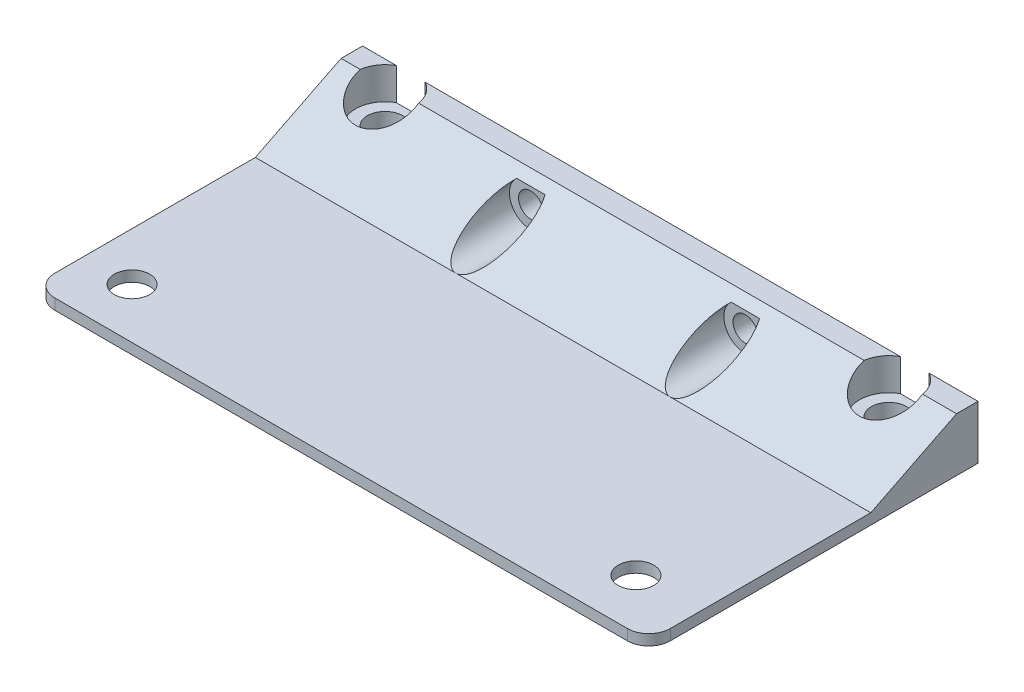
ISO-10303-21;
HEADER;
FILE_DESCRIPTION(('STEP AP214'),'2;1');
FILE_NAME('part.step','',(''),(''),'','','');
FILE_SCHEMA(('AUTOMOTIVE_DESIGN { 1 0 10303 214 1 1 1 1 }'));
ENDSEC;
DATA;
#1=APPLICATION_CONTEXT('core data for automotive mechanical design processes');
#2=APPLICATION_PROTOCOL_DEFINITION('international standard','automotive_design',2000,#1);
#3=PRODUCT_CONTEXT('',#1,'mechanical');
#4=PRODUCT('Part','Part','',(#3));
#5=PRODUCT_RELATED_PRODUCT_CATEGORY('part','',(#4));
#6=PRODUCT_DEFINITION_FORMATION('','',#4);
#7=PRODUCT_DEFINITION_CONTEXT('part definition',#1,'design');
#8=PRODUCT_DEFINITION('design','',#6,#7);
#9=PRODUCT_DEFINITION_SHAPE('','',#8);
#10=(LENGTH_UNIT() NAMED_UNIT(*) SI_UNIT(.MILLI.,.METRE.));
#11=(NAMED_UNIT(*) PLANE_ANGLE_UNIT() SI_UNIT($,.RADIAN.));
#12=(NAMED_UNIT(*) SI_UNIT($,.STERADIAN.) SOLID_ANGLE_UNIT());
#13=UNCERTAINTY_MEASURE_WITH_UNIT(LENGTH_MEASURE(1.E-05),#10,'distance_accuracy_value','');
#14=(GEOMETRIC_REPRESENTATION_CONTEXT(3) GLOBAL_UNCERTAINTY_ASSIGNED_CONTEXT((#13)) GLOBAL_UNIT_ASSIGNED_CONTEXT((#10,
#11,#12)) REPRESENTATION_CONTEXT('',''));
#15=CARTESIAN_POINT('',(0.,0.,0.));
#16=DIRECTION('',(0.,0.,1.));
#17=DIRECTION('',(1.,0.,0.));
#18=AXIS2_PLACEMENT_3D('',#15,#16,#17);
#19=CARTESIAN_POINT('',(-10.770329614269,5.,-30.7));
#20=DIRECTION('',(0.,1.,0.));
#21=DIRECTION('',(0.,0.,1.));
#22=AXIS2_PLACEMENT_3D('',#19,#20,#21);
#23=PLANE('',#22);
#24=CARTESIAN_POINT('',(4.5,5.,-28.3));
#25=DIRECTION('',(0.,1.,0.));
#26=DIRECTION('',(0.,0.,1.));
#27=AXIS2_PLACEMENT_3D('',#24,#25,#26);
#28=CIRCLE('',#27,2.75);
#29=CARTESIAN_POINT('',(5.84257215820976,5.,-30.7));
#30=VERTEX_POINT('',#29);
#31=CARTESIAN_POINT('',(7.22075357208254,5.,-28.7));
#32=VERTEX_POINT('',#31);
#33=EDGE_CURVE('E281',#30,#32,#28,.F.);
#34=ORIENTED_EDGE('',*,*,#33,.T.);
#35=DIRECTION('',(1.,0.,0.));
#36=VECTOR('',#35,1.);
#37=CARTESIAN_POINT('',(-10.770329614269,5.,-28.7));
#38=LINE('',#37,#36);
#39=CARTESIAN_POINT('',(48.7792464279174,5.,-28.7));
#40=VERTEX_POINT('',#39);
#41=EDGE_CURVE('E243',#32,#40,#38,.T.);
#42=ORIENTED_EDGE('',*,*,#41,.T.);
#43=CARTESIAN_POINT('',(51.5,5.,-28.3));
#44=DIRECTION('',(0.,1.,0.));
#45=DIRECTION('',(0.,0.,1.));
#46=AXIS2_PLACEMENT_3D('',#43,#44,#45);
#47=CIRCLE('',#46,2.75);
#48=CARTESIAN_POINT('',(50.1574278417902,5.,-30.7));
#49=VERTEX_POINT('',#48);
#50=EDGE_CURVE('E280',#40,#49,#47,.F.);
#51=ORIENTED_EDGE('',*,*,#50,.T.);
#52=DIRECTION('',(1.,0.,0.));
#53=VECTOR('',#52,1.);
#54=CARTESIAN_POINT('',(-10.770329614269,5.,-30.7));
#55=LINE('',#54,#53);
#56=EDGE_CURVE('E237',#30,#49,#55,.T.);
#57=ORIENTED_EDGE('',*,*,#56,.F.);
#58=EDGE_LOOP('',(#34,#42,#51,#57));
#59=FACE_BOUND('',#58,.T.);
#60=ADVANCED_FACE('F36',(#59),#23,.T.);
#61=CARTESIAN_POINT('',(52.8425721582098,5.,-30.7));
#62=VERTEX_POINT('',#61);
#63=CARTESIAN_POINT('',(54.2207535720825,5.,-28.7));
#64=VERTEX_POINT('',#63);
#65=EDGE_CURVE('E277',#62,#64,#47,.F.);
#66=ORIENTED_EDGE('',*,*,#65,.T.);
#67=CARTESIAN_POINT('',(57.4,5.,-28.7));
#68=VERTEX_POINT('',#67);
#69=EDGE_CURVE('E236',#64,#68,#38,.T.);
#70=ORIENTED_EDGE('',*,*,#69,.T.);
#71=DIRECTION('',(0.,0.,1.));
#72=VECTOR('',#71,1.);
#73=CARTESIAN_POINT('',(57.4,5.,-30.7));
#74=LINE('',#73,#72);
#75=CARTESIAN_POINT('',(57.4,5.,-30.7));
#76=VERTEX_POINT('',#75);
#77=EDGE_CURVE('E250',#76,#68,#74,.T.);
#78=ORIENTED_EDGE('',*,*,#77,.F.);
#79=EDGE_CURVE('E238',#62,#76,#55,.T.);
#80=ORIENTED_EDGE('',*,*,#79,.F.);
#81=EDGE_LOOP('',(#66,#70,#78,#80));
#82=FACE_BOUND('',#81,.T.);
#83=ADVANCED_FACE('F329',(#82),#23,.T.);
#84=CARTESIAN_POINT('',(0.,1.,0.));
#85=DIRECTION('',(0.,-1.,0.));
#86=DIRECTION('',(0.,0.,-1.));
#87=AXIS2_PLACEMENT_3D('',#84,#85,#86);
#88=PLANE('',#87);
#89=CARTESIAN_POINT('',(4.5,1.,-4.7));
#90=DIRECTION('',(0.,1.,0.));
#91=DIRECTION('',(0.,0.,1.));
#92=AXIS2_PLACEMENT_3D('',#89,#90,#91);
#93=CIRCLE('',#92,1.65);
#94=CARTESIAN_POINT('',(4.5,1.,-3.05));
#95=VERTEX_POINT('',#94);
#96=EDGE_CURVE('E212',#95,#95,#93,.T.);
#97=ORIENTED_EDGE('',*,*,#96,.F.);
#98=EDGE_LOOP('',(#97));
#99=FACE_BOUND('',#98,.T.);
#100=DIRECTION('',(1.,0.,0.));
#101=VECTOR('',#100,1.);
#102=CARTESIAN_POINT('',(0.,1.,0.));
#103=LINE('',#102,#101);
#104=CARTESIAN_POINT('',(2.,1.,0.));
#105=VERTEX_POINT('',#104);
#106=CARTESIAN_POINT('',(55.4,1.,0.));
#107=VERTEX_POINT('',#106);
#108=EDGE_CURVE('E203',#105,#107,#103,.T.);
#109=ORIENTED_EDGE('',*,*,#108,.T.);
#110=CARTESIAN_POINT('',(55.4,1.,-2.));
#111=DIRECTION('',(0.,-1.,0.));
#112=DIRECTION('',(0.,0.,-1.));
#113=AXIS2_PLACEMENT_3D('',#110,#111,#112);
#114=CIRCLE('',#113,2.);
#115=CARTESIAN_POINT('',(57.4,1.,-2.));
#116=VERTEX_POINT('',#115);
#117=EDGE_CURVE('E176',#107,#116,#114,.F.);
#118=ORIENTED_EDGE('',*,*,#117,.T.);
#119=DIRECTION('',(0.,0.,-1.));
#120=VECTOR('',#119,1.);
#121=CARTESIAN_POINT('',(57.4,1.,0.));
#122=LINE('',#121,#120);
#123=CARTESIAN_POINT('',(57.4,1.,-20.7));
#124=VERTEX_POINT('',#123);
#125=EDGE_CURVE('E190',#116,#124,#122,.T.);
#126=ORIENTED_EDGE('',*,*,#125,.T.);
#127=DIRECTION('',(1.,0.,0.));
#128=VECTOR('',#127,1.);
#129=CARTESIAN_POINT('',(-10.770329614269,1.,-20.7));
#130=LINE('',#129,#128);
#131=CARTESIAN_POINT('',(38.7,0.999999999999999,-20.7));
#132=VERTEX_POINT('',#131);
#133=EDGE_CURVE('E242',#132,#124,#130,.T.);
#134=ORIENTED_EDGE('',*,*,#133,.F.);
#135=CARTESIAN_POINT('',(18.7,0.999999999999999,-20.7));
#136=VERTEX_POINT('',#135);
#137=EDGE_CURVE('E246',#136,#132,#130,.T.);
#138=ORIENTED_EDGE('',*,*,#137,.F.);
#139=CARTESIAN_POINT('',(0.,1.,-20.7));
#140=VERTEX_POINT('',#139);
#141=EDGE_CURVE('E168',#140,#136,#130,.T.);
#142=ORIENTED_EDGE('',*,*,#141,.F.);
#143=DIRECTION('',(0.,0.,1.));
#144=VECTOR('',#143,1.);
#145=CARTESIAN_POINT('',(0.,1.,0.));
#146=LINE('',#145,#144);
#147=CARTESIAN_POINT('',(0.,1.,-2.));
#148=VERTEX_POINT('',#147);
#149=EDGE_CURVE('E193',#140,#148,#146,.T.);
#150=ORIENTED_EDGE('',*,*,#149,.T.);
#151=CARTESIAN_POINT('',(2.,1.,-2.));
#152=DIRECTION('',(0.,-1.,0.));
#153=DIRECTION('',(0.,0.,-1.));
#154=AXIS2_PLACEMENT_3D('',#151,#152,#153);
#155=CIRCLE('',#154,2.);
#156=EDGE_CURVE('E174',#148,#105,#155,.F.);
#157=ORIENTED_EDGE('',*,*,#156,.T.);
#158=EDGE_LOOP('',(#109,#118,#126,#134,#138,#142,#150,#157));
#159=FACE_BOUND('',#158,.T.);
#160=CARTESIAN_POINT('',(51.5,1.,-4.7));
#161=DIRECTION('',(0.,1.,0.));
#162=DIRECTION('',(0.,0.,1.));
#163=AXIS2_PLACEMENT_3D('',#160,#161,#162);
#164=CIRCLE('',#163,1.65);
#165=CARTESIAN_POINT('',(51.5,1.,-3.05));
#166=VERTEX_POINT('',#165);
#167=EDGE_CURVE('E216',#166,#166,#164,.T.);
#168=ORIENTED_EDGE('',*,*,#167,.F.);
#169=EDGE_LOOP('',(#168));
#170=FACE_BOUND('',#169,.T.);
#171=ADVANCED_FACE('F319',(#99,#159,#170),#88,.F.);
#172=CARTESIAN_POINT('',(0.,0.,0.));
#173=DIRECTION('',(0.,-1.,0.));
#174=DIRECTION('',(0.,0.,-1.));
#175=AXIS2_PLACEMENT_3D('',#172,#173,#174);
#176=PLANE('',#175);
#177=DIRECTION('',(1.,0.,0.));
#178=VECTOR('',#177,1.);
#179=CARTESIAN_POINT('',(0.,0.,0.));
#180=LINE('',#179,#178);
#181=CARTESIAN_POINT('',(2.,0.,0.));
#182=VERTEX_POINT('',#181);
#183=CARTESIAN_POINT('',(55.4,0.,0.));
#184=VERTEX_POINT('',#183);
#185=EDGE_CURVE('E194',#182,#184,#180,.T.);
#186=ORIENTED_EDGE('',*,*,#185,.F.);
#187=CARTESIAN_POINT('',(2.,0.,-2.));
#188=DIRECTION('',(0.,-1.,0.));
#189=DIRECTION('',(0.,0.,-1.));
#190=AXIS2_PLACEMENT_3D('',#187,#188,#189);
#191=CIRCLE('',#190,2.);
#192=CARTESIAN_POINT('',(0.,0.,-2.));
#193=VERTEX_POINT('',#192);
#194=EDGE_CURVE('E180',#182,#193,#191,.T.);
#195=ORIENTED_EDGE('',*,*,#194,.T.);
#196=DIRECTION('',(0.,0.,1.));
#197=VECTOR('',#196,1.);
#198=CARTESIAN_POINT('',(0.,0.,0.));
#199=LINE('',#198,#197);
#200=CARTESIAN_POINT('',(0.,0.,-30.7));
#201=VERTEX_POINT('',#200);
#202=EDGE_CURVE('E197',#201,#193,#199,.T.);
#203=ORIENTED_EDGE('',*,*,#202,.F.);
#204=DIRECTION('',(1.,0.,0.));
#205=VECTOR('',#204,1.);
#206=CARTESIAN_POINT('',(0.,0.,-30.7));
#207=LINE('',#206,#205);
#208=CARTESIAN_POINT('',(57.4,0.,-30.7));
#209=VERTEX_POINT('',#208);
#210=EDGE_CURVE('E222',#201,#209,#207,.T.);
#211=ORIENTED_EDGE('',*,*,#210,.T.);
#212=DIRECTION('',(0.,0.,-1.));
#213=VECTOR('',#212,1.);
#214=CARTESIAN_POINT('',(57.4,0.,0.));
#215=LINE('',#214,#213);
#216=CARTESIAN_POINT('',(57.4,0.,-2.));
#217=VERTEX_POINT('',#216);
#218=EDGE_CURVE('E191',#217,#209,#215,.T.);
#219=ORIENTED_EDGE('',*,*,#218,.F.);
#220=CARTESIAN_POINT('',(55.4,0.,-2.));
#221=DIRECTION('',(0.,-1.,0.));
#222=DIRECTION('',(0.,0.,-1.));
#223=AXIS2_PLACEMENT_3D('',#220,#221,#222);
#224=CIRCLE('',#223,2.);
#225=EDGE_CURVE('E182',#217,#184,#224,.T.);
#226=ORIENTED_EDGE('',*,*,#225,.T.);
#227=EDGE_LOOP('',(#186,#195,#203,#211,#219,#226));
#228=FACE_BOUND('',#227,.T.);
#229=CARTESIAN_POINT('',(4.5,0.,-4.7));
#230=DIRECTION('',(0.,1.,0.));
#231=DIRECTION('',(0.,0.,1.));
#232=AXIS2_PLACEMENT_3D('',#229,#230,#231);
#233=CIRCLE('',#232,1.65);
#234=CARTESIAN_POINT('',(4.5,0.,-3.05));
#235=VERTEX_POINT('',#234);
#236=EDGE_CURVE('E213',#235,#235,#233,.T.);
#237=ORIENTED_EDGE('',*,*,#236,.T.);
#238=EDGE_LOOP('',(#237));
#239=FACE_BOUND('',#238,.T.);
#240=CARTESIAN_POINT('',(4.5,0.,-28.3));
#241=DIRECTION('',(0.,1.,0.));
#242=DIRECTION('',(0.,0.,1.));
#243=AXIS2_PLACEMENT_3D('',#240,#241,#242);
#244=CIRCLE('',#243,1.65);
#245=CARTESIAN_POINT('',(4.5,0.,-26.65));
#246=VERTEX_POINT('',#245);
#247=EDGE_CURVE('E200',#246,#246,#244,.T.);
#248=ORIENTED_EDGE('',*,*,#247,.T.);
#249=EDGE_LOOP('',(#248));
#250=FACE_BOUND('',#249,.T.);
#251=CARTESIAN_POINT('',(51.5,0.,-28.3));
#252=DIRECTION('',(0.,1.,0.));
#253=DIRECTION('',(0.,0.,1.));
#254=AXIS2_PLACEMENT_3D('',#251,#252,#253);
#255=CIRCLE('',#254,1.65);
#256=CARTESIAN_POINT('',(51.5,0.,-26.65));
#257=VERTEX_POINT('',#256);
#258=EDGE_CURVE('E209',#257,#257,#255,.T.);
#259=ORIENTED_EDGE('',*,*,#258,.T.);
#260=EDGE_LOOP('',(#259));
#261=FACE_BOUND('',#260,.T.);
#262=CARTESIAN_POINT('',(51.5,0.,-4.7));
#263=DIRECTION('',(0.,1.,0.));
#264=DIRECTION('',(0.,0.,1.));
#265=AXIS2_PLACEMENT_3D('',#262,#263,#264);
#266=CIRCLE('',#265,1.65);
#267=CARTESIAN_POINT('',(51.5,0.,-3.05));
#268=VERTEX_POINT('',#267);
#269=EDGE_CURVE('E219',#268,#268,#266,.T.);
#270=ORIENTED_EDGE('',*,*,#269,.T.);
#271=EDGE_LOOP('',(#270));
#272=FACE_BOUND('',#271,.T.);
#273=ADVANCED_FACE('F351',(#228,#239,#250,#261,#272),#176,.T.);
#274=CARTESIAN_POINT('',(0.,1.,0.));
#275=DIRECTION('',(1.,0.,0.));
#276=DIRECTION('',(0.,0.,-1.));
#277=AXIS2_PLACEMENT_3D('',#274,#275,#276);
#278=PLANE('',#277);
#279=ORIENTED_EDGE('',*,*,#202,.T.);
#280=DIRECTION('',(0.,-1.,0.));
#281=VECTOR('',#280,1.);
#282=CARTESIAN_POINT('',(0.,1.,-2.));
#283=LINE('',#282,#281);
#284=EDGE_CURVE('E178',#193,#148,#283,.F.);
#285=ORIENTED_EDGE('',*,*,#284,.T.);
#286=ORIENTED_EDGE('',*,*,#149,.F.);
#287=DIRECTION('',(0.,0.447213595499958,-0.894427190999916));
#288=VECTOR('',#287,1.);
#289=CARTESIAN_POINT('',(0.,5.,-28.7));
#290=LINE('',#289,#288);
#291=CARTESIAN_POINT('',(0.,5.,-28.7));
#292=VERTEX_POINT('',#291);
#293=EDGE_CURVE('E230',#140,#292,#290,.T.);
#294=ORIENTED_EDGE('',*,*,#293,.T.);
#295=DIRECTION('',(0.,0.,-1.));
#296=VECTOR('',#295,1.);
#297=CARTESIAN_POINT('',(0.,5.,-30.7));
#298=LINE('',#297,#296);
#299=CARTESIAN_POINT('',(0.,5.,-30.7));
#300=VERTEX_POINT('',#299);
#301=EDGE_CURVE('E245',#292,#300,#298,.T.);
#302=ORIENTED_EDGE('',*,*,#301,.T.);
#303=DIRECTION('',(0.,1.,0.));
#304=VECTOR('',#303,1.);
#305=CARTESIAN_POINT('',(0.,-0.000999999999999916,-30.7));
#306=LINE('',#305,#304);
#307=EDGE_CURVE('E228',#201,#300,#306,.T.);
#308=ORIENTED_EDGE('',*,*,#307,.F.);
#309=EDGE_LOOP('',(#279,#285,#286,#294,#302,#308));
#310=FACE_BOUND('',#309,.T.);
#311=ADVANCED_FACE('F355',(#310),#278,.F.);
#312=CARTESIAN_POINT('',(0.,1.,0.));
#313=DIRECTION('',(0.,0.,-1.));
#314=DIRECTION('',(-1.,0.,0.));
#315=AXIS2_PLACEMENT_3D('',#312,#313,#314);
#316=PLANE('',#315);
#317=ORIENTED_EDGE('',*,*,#108,.F.);
#318=DIRECTION('',(0.,-1.,0.));
#319=VECTOR('',#318,1.);
#320=CARTESIAN_POINT('',(2.,1.,0.));
#321=LINE('',#320,#319);
#322=EDGE_CURVE('E184',#105,#182,#321,.T.);
#323=ORIENTED_EDGE('',*,*,#322,.T.);
#324=ORIENTED_EDGE('',*,*,#185,.T.);
#325=DIRECTION('',(0.,-1.,0.));
#326=VECTOR('',#325,1.);
#327=CARTESIAN_POINT('',(55.4,1.,0.));
#328=LINE('',#327,#326);
#329=EDGE_CURVE('E187',#184,#107,#328,.F.);
#330=ORIENTED_EDGE('',*,*,#329,.T.);
#331=EDGE_LOOP('',(#317,#323,#324,#330));
#332=FACE_BOUND('',#331,.T.);
#333=ADVANCED_FACE('F363',(#332),#316,.F.);
#334=CARTESIAN_POINT('',(57.4,1.,0.));
#335=DIRECTION('',(-1.,0.,0.));
#336=DIRECTION('',(0.,0.,1.));
#337=AXIS2_PLACEMENT_3D('',#334,#335,#336);
#338=PLANE('',#337);
#339=ORIENTED_EDGE('',*,*,#125,.F.);
#340=DIRECTION('',(0.,-1.,0.));
#341=VECTOR('',#340,1.);
#342=CARTESIAN_POINT('',(57.4,1.,-2.));
#343=LINE('',#342,#341);
#344=EDGE_CURVE('E158',#116,#217,#343,.T.);
#345=ORIENTED_EDGE('',*,*,#344,.T.);
#346=ORIENTED_EDGE('',*,*,#218,.T.);
#347=DIRECTION('',(0.,1.,0.));
#348=VECTOR('',#347,1.);
#349=CARTESIAN_POINT('',(57.4,-0.000999999999999916,-30.7));
#350=LINE('',#349,#348);
#351=EDGE_CURVE('E227',#209,#76,#350,.T.);
#352=ORIENTED_EDGE('',*,*,#351,.T.);
#353=ORIENTED_EDGE('',*,*,#77,.T.);
#354=DIRECTION('',(0.,-0.447213595499958,0.894427190999916));
#355=VECTOR('',#354,1.);
#356=CARTESIAN_POINT('',(57.4,5.,-28.7));
#357=LINE('',#356,#355);
#358=EDGE_CURVE('E247',#68,#124,#357,.T.);
#359=ORIENTED_EDGE('',*,*,#358,.T.);
#360=EDGE_LOOP('',(#339,#345,#346,#352,#353,#359));
#361=FACE_BOUND('',#360,.T.);
#362=ADVANCED_FACE('F324',(#361),#338,.F.);
#363=CARTESIAN_POINT('',(4.5,1.,-28.3));
#364=DIRECTION('',(0.,-1.,0.));
#365=DIRECTION('',(0.,0.,-1.));
#366=AXIS2_PLACEMENT_3D('',#363,#364,#365);
#367=CYLINDRICAL_SURFACE('',#366,1.65);
#368=ORIENTED_EDGE('',*,*,#247,.F.);
#369=EDGE_LOOP('',(#368));
#370=FACE_BOUND('',#369,.T.);
#371=CARTESIAN_POINT('',(4.5,2.,-28.3));
#372=DIRECTION('',(0.,-1.,0.));
#373=DIRECTION('',(0.,0.,-1.));
#374=AXIS2_PLACEMENT_3D('',#371,#372,#373);
#375=CIRCLE('',#374,1.65);
#376=CARTESIAN_POINT('',(4.5,2.,-29.95));
#377=VERTEX_POINT('',#376);
#378=EDGE_CURVE('E253',#377,#377,#375,.T.);
#379=ORIENTED_EDGE('',*,*,#378,.F.);
#380=EDGE_LOOP('',(#379));
#381=FACE_BOUND('',#380,.T.);
#382=ADVANCED_FACE('F421',(#370,#381),#367,.F.);
#383=CARTESIAN_POINT('',(51.5,1.,-28.3));
#384=DIRECTION('',(0.,-1.,0.));
#385=DIRECTION('',(0.,0.,-1.));
#386=AXIS2_PLACEMENT_3D('',#383,#384,#385);
#387=CYLINDRICAL_SURFACE('',#386,1.65);
#388=ORIENTED_EDGE('',*,*,#258,.F.);
#389=EDGE_LOOP('',(#388));
#390=FACE_BOUND('',#389,.T.);
#391=CARTESIAN_POINT('',(51.5,2.,-28.3));
#392=DIRECTION('',(0.,-1.,0.));
#393=DIRECTION('',(0.,0.,-1.));
#394=AXIS2_PLACEMENT_3D('',#391,#392,#393);
#395=CIRCLE('',#394,1.65);
#396=CARTESIAN_POINT('',(51.5,2.,-29.95));
#397=VERTEX_POINT('',#396);
#398=EDGE_CURVE('E257',#397,#397,#395,.T.);
#399=ORIENTED_EDGE('',*,*,#398,.F.);
#400=EDGE_LOOP('',(#399));
#401=FACE_BOUND('',#400,.T.);
#402=ADVANCED_FACE('F418',(#390,#401),#387,.F.);
#403=CARTESIAN_POINT('',(4.5,1.,-4.7));
#404=DIRECTION('',(0.,-1.,0.));
#405=DIRECTION('',(0.,0.,-1.));
#406=AXIS2_PLACEMENT_3D('',#403,#404,#405);
#407=CYLINDRICAL_SURFACE('',#406,1.65);
#408=ORIENTED_EDGE('',*,*,#96,.T.);
#409=EDGE_LOOP('',(#408));
#410=FACE_BOUND('',#409,.T.);
#411=ORIENTED_EDGE('',*,*,#236,.F.);
#412=EDGE_LOOP('',(#411));
#413=FACE_BOUND('',#412,.T.);
#414=ADVANCED_FACE('F420',(#410,#413),#407,.F.);
#415=CARTESIAN_POINT('',(51.5,1.,-4.7));
#416=DIRECTION('',(0.,-1.,0.));
#417=DIRECTION('',(0.,0.,-1.));
#418=AXIS2_PLACEMENT_3D('',#415,#416,#417);
#419=CYLINDRICAL_SURFACE('',#418,1.65);
#420=ORIENTED_EDGE('',*,*,#167,.T.);
#421=EDGE_LOOP('',(#420));
#422=FACE_BOUND('',#421,.T.);
#423=ORIENTED_EDGE('',*,*,#269,.F.);
#424=EDGE_LOOP('',(#423));
#425=FACE_BOUND('',#424,.T.);
#426=ADVANCED_FACE('F387',(#422,#425),#419,.F.);
#427=CARTESIAN_POINT('',(0.,-0.000999999999999916,-30.7));
#428=DIRECTION('',(0.,0.,1.));
#429=DIRECTION('',(1.,0.,0.));
#430=AXIS2_PLACEMENT_3D('',#427,#428,#429);
#431=PLANE('',#430);
#432=CARTESIAN_POINT('',(38.7,3.,-30.7));
#433=DIRECTION('',(0.,0.,-1.));
#434=DIRECTION('',(-1.,0.,0.));
#435=AXIS2_PLACEMENT_3D('',#432,#433,#434);
#436=CIRCLE('',#435,1.15);
#437=CARTESIAN_POINT('',(37.55,3.,-30.7));
#438=VERTEX_POINT('',#437);
#439=EDGE_CURVE('E303',#438,#438,#436,.T.);
#440=ORIENTED_EDGE('',*,*,#439,.F.);
#441=EDGE_LOOP('',(#440));
#442=FACE_BOUND('',#441,.T.);
#443=CARTESIAN_POINT('',(18.7,3.,-30.7));
#444=DIRECTION('',(0.,0.,-1.));
#445=DIRECTION('',(-1.,0.,0.));
#446=AXIS2_PLACEMENT_3D('',#443,#444,#445);
#447=CIRCLE('',#446,1.15);
#448=CARTESIAN_POINT('',(17.55,3.,-30.7));
#449=VERTEX_POINT('',#448);
#450=EDGE_CURVE('E300',#449,#449,#447,.T.);
#451=ORIENTED_EDGE('',*,*,#450,.F.);
#452=EDGE_LOOP('',(#451));
#453=FACE_BOUND('',#452,.T.);
#454=CARTESIAN_POINT('',(3.15742784179024,5.,-30.7));
#455=VERTEX_POINT('',#454);
#456=EDGE_CURVE('E233',#300,#455,#55,.T.);
#457=ORIENTED_EDGE('',*,*,#456,.T.);
#458=DIRECTION('',(0.,-1.,0.));
#459=VECTOR('',#458,1.);
#460=CARTESIAN_POINT('',(3.15742784179024,5.001,-30.7));
#461=LINE('',#460,#459);
#462=CARTESIAN_POINT('',(3.15742784179024,2.,-30.7));
#463=VERTEX_POINT('',#462);
#464=EDGE_CURVE('E292',#463,#455,#461,.F.);
#465=ORIENTED_EDGE('',*,*,#464,.F.);
#466=DIRECTION('',(-1.,0.,0.));
#467=VECTOR('',#466,1.);
#468=CARTESIAN_POINT('',(4.5,2.,-30.7));
#469=LINE('',#468,#467);
#470=CARTESIAN_POINT('',(5.84257215820976,2.,-30.7));
#471=VERTEX_POINT('',#470);
#472=EDGE_CURVE('E287',#471,#463,#469,.T.);
#473=ORIENTED_EDGE('',*,*,#472,.F.);
#474=DIRECTION('',(0.,-1.,0.));
#475=VECTOR('',#474,1.);
#476=CARTESIAN_POINT('',(5.84257215820976,5.001,-30.7));
#477=LINE('',#476,#475);
#478=EDGE_CURVE('E266',#30,#471,#477,.T.);
#479=ORIENTED_EDGE('',*,*,#478,.F.);
#480=ORIENTED_EDGE('',*,*,#56,.T.);
#481=DIRECTION('',(0.,-1.,0.));
#482=VECTOR('',#481,1.);
#483=CARTESIAN_POINT('',(50.1574278417902,5.001,-30.7));
#484=LINE('',#483,#482);
#485=CARTESIAN_POINT('',(50.1574278417902,2.,-30.7));
#486=VERTEX_POINT('',#485);
#487=EDGE_CURVE('E267',#486,#49,#484,.F.);
#488=ORIENTED_EDGE('',*,*,#487,.F.);
#489=DIRECTION('',(-1.,0.,0.));
#490=VECTOR('',#489,1.);
#491=CARTESIAN_POINT('',(51.5,2.,-30.7));
#492=LINE('',#491,#490);
#493=CARTESIAN_POINT('',(52.8425721582098,2.,-30.7));
#494=VERTEX_POINT('',#493);
#495=EDGE_CURVE('E271',#494,#486,#492,.T.);
#496=ORIENTED_EDGE('',*,*,#495,.F.);
#497=DIRECTION('',(0.,-1.,0.));
#498=VECTOR('',#497,1.);
#499=CARTESIAN_POINT('',(52.8425721582098,5.001,-30.7));
#500=LINE('',#499,#498);
#501=EDGE_CURVE('E263',#62,#494,#500,.T.);
#502=ORIENTED_EDGE('',*,*,#501,.F.);
#503=ORIENTED_EDGE('',*,*,#79,.T.);
#504=ORIENTED_EDGE('',*,*,#351,.F.);
#505=ORIENTED_EDGE('',*,*,#210,.F.);
#506=ORIENTED_EDGE('',*,*,#307,.T.);
#507=EDGE_LOOP('',(#457,#465,#473,#479,#480,#488,#496,#502,#503,#504,#505,#506));
#508=FACE_BOUND('',#507,.T.);
#509=ADVANCED_FACE('F343',(#442,#453,#508),#431,.F.);
#510=CARTESIAN_POINT('',(1.77924642791743,5.,-28.7));
#511=VERTEX_POINT('',#510);
#512=EDGE_CURVE('E260',#511,#455,#28,.F.);
#513=ORIENTED_EDGE('',*,*,#512,.T.);
#514=ORIENTED_EDGE('',*,*,#456,.F.);
#515=ORIENTED_EDGE('',*,*,#301,.F.);
#516=EDGE_CURVE('E239',#292,#511,#38,.T.);
#517=ORIENTED_EDGE('',*,*,#516,.T.);
#518=EDGE_LOOP('',(#513,#514,#515,#517));
#519=FACE_BOUND('',#518,.T.);
#520=ADVANCED_FACE('F375',(#519),#23,.T.);
#521=CARTESIAN_POINT('',(-10.770329614269,5.,-28.7));
#522=DIRECTION('',(0.,0.894427190999916,0.447213595499958));
#523=DIRECTION('',(0.,-0.447213595499958,0.894427190999916));
#524=AXIS2_PLACEMENT_3D('',#521,#522,#523);
#525=PLANE('',#524);
#526=CARTESIAN_POINT('',(38.7,3.,-24.7));
#527=DIRECTION('',(0.,0.894427190999916,0.447213595499958));
#528=DIRECTION('',(0.,0.447213595499958,-0.894427190999916));
#529=AXIS2_PLACEMENT_3D('',#526,#527,#528);
#530=ELLIPSE('',#529,4.47213595499959,2.);
#531=CARTESIAN_POINT('',(37.3771243444677,4.5,-27.7));
#532=VERTEX_POINT('',#531);
#533=EDGE_CURVE('E11',#532,#132,#530,.T.);
#534=ORIENTED_EDGE('',*,*,#533,.F.);
#535=DIRECTION('',(-1.,0.,0.));
#536=VECTOR('',#535,1.);
#537=CARTESIAN_POINT('',(-10.770329614269,4.5,-27.7));
#538=LINE('',#537,#536);
#539=CARTESIAN_POINT('',(40.0228756555323,4.5,-27.7));
#540=VERTEX_POINT('',#539);
#541=EDGE_CURVE('E169',#540,#532,#538,.T.);
#542=ORIENTED_EDGE('',*,*,#541,.F.);
#543=EDGE_CURVE('E40',#132,#540,#530,.T.);
#544=ORIENTED_EDGE('',*,*,#543,.F.);
#545=ORIENTED_EDGE('',*,*,#133,.T.);
#546=ORIENTED_EDGE('',*,*,#358,.F.);
#547=ORIENTED_EDGE('',*,*,#69,.F.);
#548=CARTESIAN_POINT('',(51.5,4.8,-28.3));
#549=DIRECTION('',(0.,0.894427190999916,0.447213595499958));
#550=DIRECTION('',(0.,-0.447213595499958,0.894427190999916));
#551=AXIS2_PLACEMENT_3D('',#548,#549,#550);
#552=ELLIPSE('',#551,3.07459346906221,2.75);
#553=EDGE_CURVE('E274',#64,#40,#552,.F.);
#554=ORIENTED_EDGE('',*,*,#553,.T.);
#555=ORIENTED_EDGE('',*,*,#41,.F.);
#556=CARTESIAN_POINT('',(4.5,4.8,-28.3));
#557=DIRECTION('',(0.,0.894427190999916,0.447213595499958));
#558=DIRECTION('',(0.,-0.447213595499958,0.894427190999916));
#559=AXIS2_PLACEMENT_3D('',#556,#557,#558);
#560=ELLIPSE('',#559,3.07459346906221,2.75);
#561=EDGE_CURVE('E284',#32,#511,#560,.F.);
#562=ORIENTED_EDGE('',*,*,#561,.T.);
#563=ORIENTED_EDGE('',*,*,#516,.F.);
#564=ORIENTED_EDGE('',*,*,#293,.F.);
#565=ORIENTED_EDGE('',*,*,#141,.T.);
#566=CARTESIAN_POINT('',(18.7,3.,-24.7));
#567=DIRECTION('',(0.,0.894427190999916,0.447213595499958));
#568=DIRECTION('',(0.,0.447213595499958,-0.894427190999916));
#569=AXIS2_PLACEMENT_3D('',#566,#567,#568);
#570=ELLIPSE('',#569,4.47213595499959,2.);
#571=CARTESIAN_POINT('',(17.3771243444677,4.5,-27.7));
#572=VERTEX_POINT('',#571);
#573=EDGE_CURVE('E162',#572,#136,#570,.T.);
#574=ORIENTED_EDGE('',*,*,#573,.F.);
#575=DIRECTION('',(-1.,0.,0.));
#576=VECTOR('',#575,1.);
#577=CARTESIAN_POINT('',(-10.770329614269,4.5,-27.7));
#578=LINE('',#577,#576);
#579=CARTESIAN_POINT('',(20.0228756555323,4.5,-27.7));
#580=VERTEX_POINT('',#579);
#581=EDGE_CURVE('E152',#580,#572,#578,.T.);
#582=ORIENTED_EDGE('',*,*,#581,.F.);
#583=EDGE_CURVE('E157',#136,#580,#570,.T.);
#584=ORIENTED_EDGE('',*,*,#583,.F.);
#585=ORIENTED_EDGE('',*,*,#137,.T.);
#586=EDGE_LOOP('',(#534,#542,#544,#545,#546,#547,#554,#555,#562,#563,#564,#565,#574,#582,#584,#585));
#587=FACE_BOUND('',#586,.T.);
#588=ADVANCED_FACE('F166',(#587),#525,.T.);
#589=CARTESIAN_POINT('',(2.,1.,-2.));
#590=DIRECTION('',(0.,-1.,0.));
#591=DIRECTION('',(0.,0.,-1.));
#592=AXIS2_PLACEMENT_3D('',#589,#590,#591);
#593=CYLINDRICAL_SURFACE('',#592,2.);
#594=ORIENTED_EDGE('',*,*,#156,.F.);
#595=ORIENTED_EDGE('',*,*,#284,.F.);
#596=ORIENTED_EDGE('',*,*,#194,.F.);
#597=ORIENTED_EDGE('',*,*,#322,.F.);
#598=EDGE_LOOP('',(#594,#595,#596,#597));
#599=FACE_BOUND('',#598,.T.);
#600=ADVANCED_FACE('F359',(#599),#593,.T.);
#601=CARTESIAN_POINT('',(55.4,1.,-2.));
#602=DIRECTION('',(0.,-1.,0.));
#603=DIRECTION('',(0.,0.,-1.));
#604=AXIS2_PLACEMENT_3D('',#601,#602,#603);
#605=CYLINDRICAL_SURFACE('',#604,2.);
#606=ORIENTED_EDGE('',*,*,#117,.F.);
#607=ORIENTED_EDGE('',*,*,#329,.F.);
#608=ORIENTED_EDGE('',*,*,#225,.F.);
#609=ORIENTED_EDGE('',*,*,#344,.F.);
#610=EDGE_LOOP('',(#606,#607,#608,#609));
#611=FACE_BOUND('',#610,.T.);
#612=ADVANCED_FACE('F38',(#611),#605,.T.);
#613=CARTESIAN_POINT('',(51.5,5.001,-28.3));
#614=DIRECTION('',(0.,-1.,0.));
#615=DIRECTION('',(0.,0.,-1.));
#616=AXIS2_PLACEMENT_3D('',#613,#614,#615);
#617=CYLINDRICAL_SURFACE('',#616,2.75);
#618=ORIENTED_EDGE('',*,*,#487,.T.);
#619=ORIENTED_EDGE('',*,*,#50,.F.);
#620=ORIENTED_EDGE('',*,*,#553,.F.);
#621=ORIENTED_EDGE('',*,*,#65,.F.);
#622=ORIENTED_EDGE('',*,*,#501,.T.);
#623=CARTESIAN_POINT('',(51.5,2.,-28.3));
#624=DIRECTION('',(0.,-1.,0.));
#625=DIRECTION('',(0.,0.,-1.));
#626=AXIS2_PLACEMENT_3D('',#623,#624,#625);
#627=CIRCLE('',#626,2.75);
#628=EDGE_CURVE('E269',#494,#486,#627,.T.);
#629=ORIENTED_EDGE('',*,*,#628,.T.);
#630=EDGE_LOOP('',(#618,#619,#620,#621,#622,#629));
#631=FACE_BOUND('',#630,.T.);
#632=ADVANCED_FACE('F338',(#631),#617,.F.);
#633=CARTESIAN_POINT('',(51.5,2.,-28.3));
#634=DIRECTION('',(0.,-1.,0.));
#635=DIRECTION('',(0.,0.,-1.));
#636=AXIS2_PLACEMENT_3D('',#633,#634,#635);
#637=PLANE('',#636);
#638=ORIENTED_EDGE('',*,*,#398,.T.);
#639=EDGE_LOOP('',(#638));
#640=FACE_BOUND('',#639,.T.);
#641=ORIENTED_EDGE('',*,*,#495,.T.);
#642=ORIENTED_EDGE('',*,*,#628,.F.);
#643=EDGE_LOOP('',(#641,#642));
#644=FACE_BOUND('',#643,.T.);
#645=ADVANCED_FACE('F371',(#640,#644),#637,.F.);
#646=CARTESIAN_POINT('',(4.5,5.001,-28.3));
#647=DIRECTION('',(0.,-1.,0.));
#648=DIRECTION('',(0.,0.,-1.));
#649=AXIS2_PLACEMENT_3D('',#646,#647,#648);
#650=CYLINDRICAL_SURFACE('',#649,2.75);
#651=ORIENTED_EDGE('',*,*,#464,.T.);
#652=ORIENTED_EDGE('',*,*,#512,.F.);
#653=ORIENTED_EDGE('',*,*,#561,.F.);
#654=ORIENTED_EDGE('',*,*,#33,.F.);
#655=ORIENTED_EDGE('',*,*,#478,.T.);
#656=CARTESIAN_POINT('',(4.5,2.,-28.3));
#657=DIRECTION('',(0.,-1.,0.));
#658=DIRECTION('',(0.,0.,-1.));
#659=AXIS2_PLACEMENT_3D('',#656,#657,#658);
#660=CIRCLE('',#659,2.75);
#661=EDGE_CURVE('E290',#471,#463,#660,.T.);
#662=ORIENTED_EDGE('',*,*,#661,.T.);
#663=EDGE_LOOP('',(#651,#652,#653,#654,#655,#662));
#664=FACE_BOUND('',#663,.T.);
#665=ADVANCED_FACE('F394',(#664),#650,.F.);
#666=CARTESIAN_POINT('',(4.5,2.,-28.3));
#667=DIRECTION('',(0.,-1.,0.));
#668=DIRECTION('',(0.,0.,-1.));
#669=AXIS2_PLACEMENT_3D('',#666,#667,#668);
#670=PLANE('',#669);
#671=ORIENTED_EDGE('',*,*,#378,.T.);
#672=EDGE_LOOP('',(#671));
#673=FACE_BOUND('',#672,.T.);
#674=ORIENTED_EDGE('',*,*,#472,.T.);
#675=ORIENTED_EDGE('',*,*,#661,.F.);
#676=EDGE_LOOP('',(#674,#675));
#677=FACE_BOUND('',#676,.T.);
#678=ADVANCED_FACE('F396',(#673,#677),#670,.F.);
#679=CARTESIAN_POINT('',(18.7,3.,-27.7));
#680=DIRECTION('',(0.,0.,-1.));
#681=DIRECTION('',(-1.,0.,0.));
#682=AXIS2_PLACEMENT_3D('',#679,#680,#681);
#683=CYLINDRICAL_SURFACE('',#682,1.15);
#684=CARTESIAN_POINT('',(18.7,3.,-27.7));
#685=DIRECTION('',(0.,0.,-1.));
#686=DIRECTION('',(-1.,0.,0.));
#687=AXIS2_PLACEMENT_3D('',#684,#685,#686);
#688=CIRCLE('',#687,1.15);
#689=CARTESIAN_POINT('',(17.55,3.,-27.7));
#690=VERTEX_POINT('',#689);
#691=EDGE_CURVE('E296',#690,#690,#688,.T.);
#692=ORIENTED_EDGE('',*,*,#691,.F.);
#693=EDGE_LOOP('',(#692));
#694=FACE_BOUND('',#693,.T.);
#695=ORIENTED_EDGE('',*,*,#450,.T.);
#696=EDGE_LOOP('',(#695));
#697=FACE_BOUND('',#696,.T.);
#698=ADVANCED_FACE('F398',(#694,#697),#683,.F.);
#699=CARTESIAN_POINT('',(38.7,3.,-27.7));
#700=DIRECTION('',(0.,0.,-1.));
#701=DIRECTION('',(-1.,0.,0.));
#702=AXIS2_PLACEMENT_3D('',#699,#700,#701);
#703=CYLINDRICAL_SURFACE('',#702,1.15);
#704=CARTESIAN_POINT('',(38.7,3.,-27.7));
#705=DIRECTION('',(0.,0.,-1.));
#706=DIRECTION('',(-1.,0.,0.));
#707=AXIS2_PLACEMENT_3D('',#704,#705,#706);
#708=CIRCLE('',#707,1.15);
#709=CARTESIAN_POINT('',(37.55,3.,-27.7));
#710=VERTEX_POINT('',#709);
#711=EDGE_CURVE('E299',#710,#710,#708,.T.);
#712=ORIENTED_EDGE('',*,*,#711,.F.);
#713=EDGE_LOOP('',(#712));
#714=FACE_BOUND('',#713,.T.);
#715=ORIENTED_EDGE('',*,*,#439,.T.);
#716=EDGE_LOOP('',(#715));
#717=FACE_BOUND('',#716,.T.);
#718=ADVANCED_FACE('F405',(#714,#717),#703,.F.);
#719=CARTESIAN_POINT('',(18.7,3.,0.));
#720=DIRECTION('',(0.,0.,-1.));
#721=DIRECTION('',(-1.,0.,0.));
#722=AXIS2_PLACEMENT_3D('',#719,#720,#721);
#723=CYLINDRICAL_SURFACE('',#722,2.);
#724=ORIENTED_EDGE('',*,*,#573,.T.);
#725=ORIENTED_EDGE('',*,*,#583,.T.);
#726=CARTESIAN_POINT('',(18.7,3.,-27.7));
#727=DIRECTION('',(0.,0.,-1.));
#728=DIRECTION('',(-1.,0.,0.));
#729=AXIS2_PLACEMENT_3D('',#726,#727,#728);
#730=CIRCLE('',#729,2.);
#731=EDGE_CURVE('E57',#580,#572,#730,.T.);
#732=ORIENTED_EDGE('',*,*,#731,.T.);
#733=EDGE_LOOP('',(#724,#725,#732));
#734=FACE_BOUND('',#733,.T.);
#735=ADVANCED_FACE('F161',(#734),#723,.F.);
#736=CARTESIAN_POINT('',(18.7,3.,-27.7));
#737=DIRECTION('',(0.,0.,-1.));
#738=DIRECTION('',(-1.,0.,0.));
#739=AXIS2_PLACEMENT_3D('',#736,#737,#738);
#740=PLANE('',#739);
#741=ORIENTED_EDGE('',*,*,#691,.T.);
#742=EDGE_LOOP('',(#741));
#743=FACE_BOUND('',#742,.T.);
#744=ORIENTED_EDGE('',*,*,#581,.T.);
#745=ORIENTED_EDGE('',*,*,#731,.F.);
#746=EDGE_LOOP('',(#744,#745));
#747=FACE_BOUND('',#746,.T.);
#748=ADVANCED_FACE('F153',(#743,#747),#740,.F.);
#749=CARTESIAN_POINT('',(38.7,3.,0.));
#750=DIRECTION('',(0.,0.,-1.));
#751=DIRECTION('',(-1.,0.,0.));
#752=AXIS2_PLACEMENT_3D('',#749,#750,#751);
#753=CYLINDRICAL_SURFACE('',#752,2.);
#754=ORIENTED_EDGE('',*,*,#533,.T.);
#755=ORIENTED_EDGE('',*,*,#543,.T.);
#756=CARTESIAN_POINT('',(38.7,3.,-27.7));
#757=DIRECTION('',(0.,0.,-1.));
#758=DIRECTION('',(-1.,0.,0.));
#759=AXIS2_PLACEMENT_3D('',#756,#757,#758);
#760=CIRCLE('',#759,2.);
#761=EDGE_CURVE('E50',#540,#532,#760,.T.);
#762=ORIENTED_EDGE('',*,*,#761,.T.);
#763=EDGE_LOOP('',(#754,#755,#762));
#764=FACE_BOUND('',#763,.T.);
#765=ADVANCED_FACE('F309',(#764),#753,.F.);
#766=CARTESIAN_POINT('',(38.7,3.,-27.7));
#767=DIRECTION('',(0.,0.,-1.));
#768=DIRECTION('',(-1.,0.,0.));
#769=AXIS2_PLACEMENT_3D('',#766,#767,#768);
#770=PLANE('',#769);
#771=ORIENTED_EDGE('',*,*,#711,.T.);
#772=EDGE_LOOP('',(#771));
#773=FACE_BOUND('',#772,.T.);
#774=ORIENTED_EDGE('',*,*,#541,.T.);
#775=ORIENTED_EDGE('',*,*,#761,.F.);
#776=EDGE_LOOP('',(#774,#775));
#777=FACE_BOUND('',#776,.T.);
#778=ADVANCED_FACE('F592',(#773,#777),#770,.F.);
#779=CLOSED_SHELL('',(#60,#83,#171,#273,#311,#333,#362,#382,#402,#414,#426,#509,#520,#588,#600,
#612,#632,#645,#665,#678,#698,#718,#735,#748,#765,#778));
#780=MANIFOLD_SOLID_BREP('B2',#779);
#781=ADVANCED_BREP_SHAPE_REPRESENTATION('',(#18,#780),#14);
#782=SHAPE_DEFINITION_REPRESENTATION(#9,#781);
ENDSEC;
END-ISO-10303-21;
